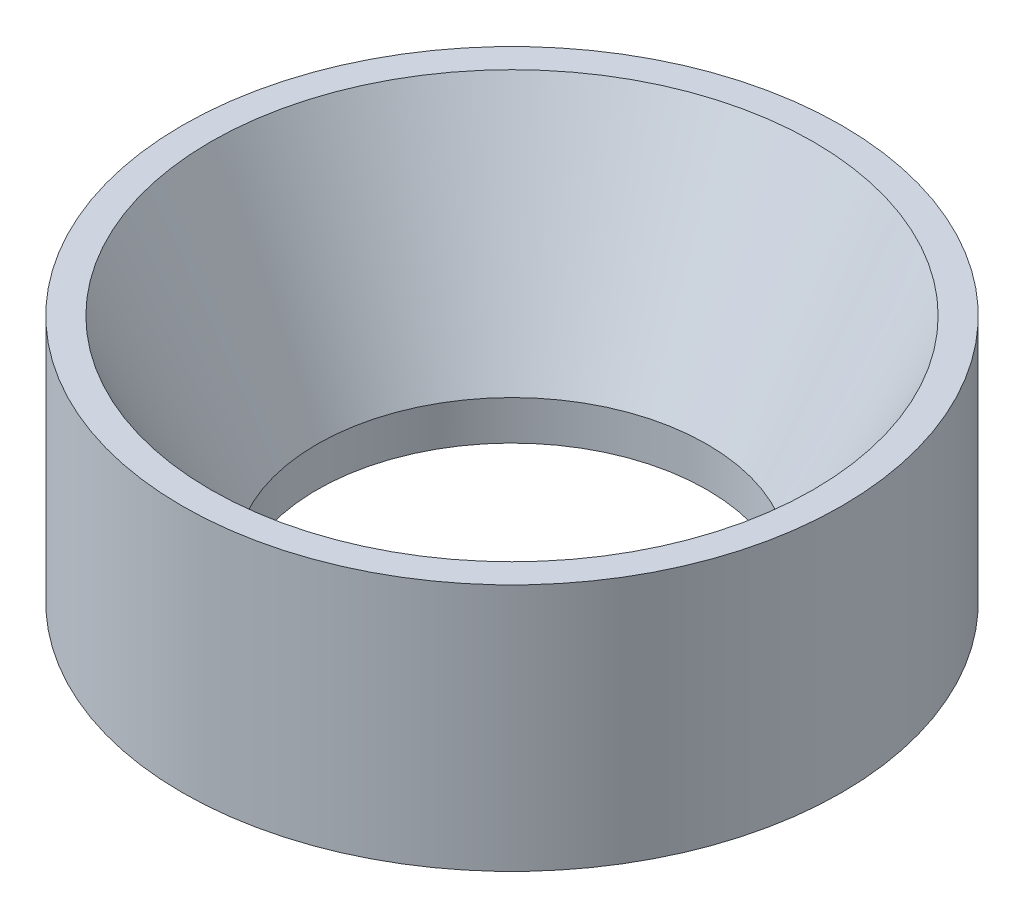
ISO-10303-21;
HEADER;
FILE_DESCRIPTION(('STEP AP214'),'2;1');
FILE_NAME('part.step','',(''),(''),'','','');
FILE_SCHEMA(('AUTOMOTIVE_DESIGN { 1 0 10303 214 1 1 1 1 }'));
ENDSEC;
DATA;
#1=APPLICATION_CONTEXT('core data for automotive mechanical design processes');
#2=APPLICATION_PROTOCOL_DEFINITION('international standard','automotive_design',2000,#1);
#3=PRODUCT_CONTEXT('',#1,'mechanical');
#4=PRODUCT('Part','Part','',(#3));
#5=PRODUCT_RELATED_PRODUCT_CATEGORY('part','',(#4));
#6=PRODUCT_DEFINITION_FORMATION('','',#4);
#7=PRODUCT_DEFINITION_CONTEXT('part definition',#1,'design');
#8=PRODUCT_DEFINITION('design','',#6,#7);
#9=PRODUCT_DEFINITION_SHAPE('','',#8);
#10=(LENGTH_UNIT() NAMED_UNIT(*) SI_UNIT(.MILLI.,.METRE.));
#11=(NAMED_UNIT(*) PLANE_ANGLE_UNIT() SI_UNIT($,.RADIAN.));
#12=(NAMED_UNIT(*) SI_UNIT($,.STERADIAN.) SOLID_ANGLE_UNIT());
#13=UNCERTAINTY_MEASURE_WITH_UNIT(LENGTH_MEASURE(1.E-05),#10,'distance_accuracy_value','');
#14=(GEOMETRIC_REPRESENTATION_CONTEXT(3) GLOBAL_UNCERTAINTY_ASSIGNED_CONTEXT((#13)) GLOBAL_UNIT_ASSIGNED_CONTEXT((#10,
#11,#12)) REPRESENTATION_CONTEXT('',''));
#15=CARTESIAN_POINT('',(0.,0.,0.));
#16=DIRECTION('',(0.,0.,1.));
#17=DIRECTION('',(1.,0.,0.));
#18=AXIS2_PLACEMENT_3D('',#15,#16,#17);
#19=CARTESIAN_POINT('',(0.,3.49999999995945,0.));
#20=DIRECTION('',(0.,1.,0.));
#21=DIRECTION('',(0.,0.,1.));
#22=AXIS2_PLACEMENT_3D('',#19,#20,#21);
#23=CONICAL_SURFACE('',#22,4.25000000001319,0.471238898035395);
#24=CARTESIAN_POINT('',(0.,3.49999999995945,0.));
#25=DIRECTION('',(0.,1.,0.));
#26=DIRECTION('',(0.,0.,1.));
#27=AXIS2_PLACEMENT_3D('',#24,#25,#26);
#28=CIRCLE('',#27,4.25000000001319);
#29=CARTESIAN_POINT('',(0.,3.49999999995945,4.25000000001319));
#30=VERTEX_POINT('',#29);
#31=EDGE_CURVE('E19',#30,#30,#28,.F.);
#32=ORIENTED_EDGE('',*,*,#31,.F.);
#33=EDGE_LOOP('',(#32));
#34=FACE_BOUND('',#33,.T.);
#35=CARTESIAN_POINT('',(0.,0.556084241742276,0.));
#36=DIRECTION('',(0.,-1.,0.));
#37=DIRECTION('',(0.,0.,-1.));
#38=AXIS2_PLACEMENT_3D('',#35,#36,#37);
#39=CIRCLE('',#38,2.75);
#40=CARTESIAN_POINT('',(0.,0.556084241742276,-2.75));
#41=VERTEX_POINT('',#40);
#42=EDGE_CURVE('E31',#41,#41,#39,.T.);
#43=ORIENTED_EDGE('',*,*,#42,.T.);
#44=EDGE_LOOP('',(#43));
#45=FACE_BOUND('',#44,.T.);
#46=ADVANCED_FACE('F15',(#34,#45),#23,.F.);
#47=CARTESIAN_POINT('',(0.,1.,0.));
#48=DIRECTION('',(0.,-1.,0.));
#49=DIRECTION('',(0.,0.,-1.));
#50=AXIS2_PLACEMENT_3D('',#47,#48,#49);
#51=CYLINDRICAL_SURFACE('',#50,2.75);
#52=ORIENTED_EDGE('',*,*,#42,.F.);
#53=EDGE_LOOP('',(#52));
#54=FACE_BOUND('',#53,.T.);
#55=CARTESIAN_POINT('',(0.,0.,0.));
#56=DIRECTION('',(0.,-1.,0.));
#57=DIRECTION('',(0.,0.,-1.));
#58=AXIS2_PLACEMENT_3D('',#55,#56,#57);
#59=CIRCLE('',#58,2.75);
#60=CARTESIAN_POINT('',(0.,0.,-2.75));
#61=VERTEX_POINT('',#60);
#62=EDGE_CURVE('E28',#61,#61,#59,.T.);
#63=ORIENTED_EDGE('',*,*,#62,.T.);
#64=EDGE_LOOP('',(#63));
#65=FACE_BOUND('',#64,.T.);
#66=ADVANCED_FACE('F42',(#54,#65),#51,.F.);
#67=CARTESIAN_POINT('',(0.,3.5,0.));
#68=DIRECTION('',(0.,1.,0.));
#69=DIRECTION('',(0.,0.,1.));
#70=AXIS2_PLACEMENT_3D('',#67,#68,#69);
#71=PLANE('',#70);
#72=CARTESIAN_POINT('',(0.,3.5,0.));
#73=DIRECTION('',(0.,-1.,0.));
#74=DIRECTION('',(0.,0.,-1.));
#75=AXIS2_PLACEMENT_3D('',#72,#73,#74);
#76=CIRCLE('',#75,4.65);
#77=CARTESIAN_POINT('',(0.,3.5,-4.65));
#78=VERTEX_POINT('',#77);
#79=EDGE_CURVE('E23',#78,#78,#76,.T.);
#80=ORIENTED_EDGE('',*,*,#79,.F.);
#81=EDGE_LOOP('',(#80));
#82=FACE_BOUND('',#81,.T.);
#83=ORIENTED_EDGE('',*,*,#31,.T.);
#84=EDGE_LOOP('',(#83));
#85=FACE_BOUND('',#84,.T.);
#86=ADVANCED_FACE('F44',(#82,#85),#71,.T.);
#87=CARTESIAN_POINT('',(0.,0.,0.));
#88=DIRECTION('',(0.,1.,0.));
#89=DIRECTION('',(0.,0.,1.));
#90=AXIS2_PLACEMENT_3D('',#87,#88,#89);
#91=PLANE('',#90);
#92=CARTESIAN_POINT('',(0.,0.,0.));
#93=DIRECTION('',(0.,-1.,0.));
#94=DIRECTION('',(0.,0.,-1.));
#95=AXIS2_PLACEMENT_3D('',#92,#93,#94);
#96=CIRCLE('',#95,4.65);
#97=CARTESIAN_POINT('',(0.,0.,-4.65));
#98=VERTEX_POINT('',#97);
#99=EDGE_CURVE('E10',#98,#98,#96,.F.);
#100=ORIENTED_EDGE('',*,*,#99,.F.);
#101=EDGE_LOOP('',(#100));
#102=FACE_BOUND('',#101,.T.);
#103=ORIENTED_EDGE('',*,*,#62,.F.);
#104=EDGE_LOOP('',(#103));
#105=FACE_BOUND('',#104,.T.);
#106=ADVANCED_FACE('F51',(#102,#105),#91,.F.);
#107=CARTESIAN_POINT('',(0.,3.5,0.));
#108=DIRECTION('',(0.,-1.,0.));
#109=DIRECTION('',(0.,0.,-1.));
#110=AXIS2_PLACEMENT_3D('',#107,#108,#109);
#111=CYLINDRICAL_SURFACE('',#110,4.65);
#112=ORIENTED_EDGE('',*,*,#99,.T.);
#113=EDGE_LOOP('',(#112));
#114=FACE_BOUND('',#113,.T.);
#115=ORIENTED_EDGE('',*,*,#79,.T.);
#116=EDGE_LOOP('',(#115));
#117=FACE_BOUND('',#116,.T.);
#118=ADVANCED_FACE('F17',(#114,#117),#111,.T.);
#119=CLOSED_SHELL('',(#46,#66,#86,#106,#118));
#120=MANIFOLD_SOLID_BREP('B1',#119);
#121=ADVANCED_BREP_SHAPE_REPRESENTATION('',(#18,#120),#14);
#122=SHAPE_DEFINITION_REPRESENTATION(#9,#121);
ENDSEC;
END-ISO-10303-21;
